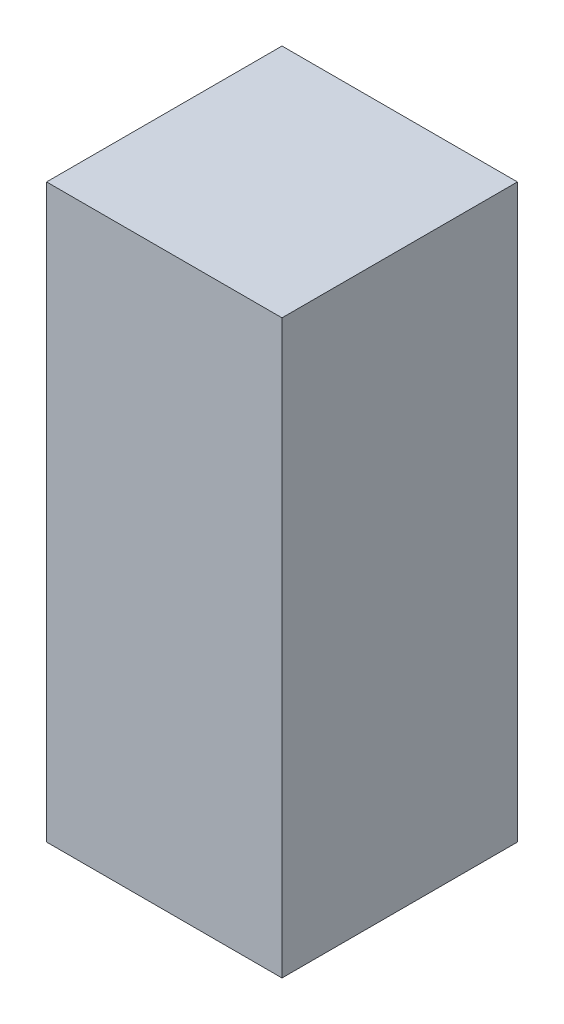
ISO-10303-21;
HEADER;
FILE_DESCRIPTION(('STEP AP214'),'2;1');
FILE_NAME('part.step','',(''),(''),'','','');
FILE_SCHEMA(('AUTOMOTIVE_DESIGN { 1 0 10303 214 1 1 1 1 }'));
ENDSEC;
DATA;
#1=APPLICATION_CONTEXT('core data for automotive mechanical design processes');
#2=APPLICATION_PROTOCOL_DEFINITION('international standard','automotive_design',2000,#1);
#3=PRODUCT_CONTEXT('',#1,'mechanical');
#4=PRODUCT('Part','Part','',(#3));
#5=PRODUCT_RELATED_PRODUCT_CATEGORY('part','',(#4));
#6=PRODUCT_DEFINITION_FORMATION('','',#4);
#7=PRODUCT_DEFINITION_CONTEXT('part definition',#1,'design');
#8=PRODUCT_DEFINITION('design','',#6,#7);
#9=PRODUCT_DEFINITION_SHAPE('','',#8);
#10=(LENGTH_UNIT() NAMED_UNIT(*) SI_UNIT(.MILLI.,.METRE.));
#11=(NAMED_UNIT(*) PLANE_ANGLE_UNIT() SI_UNIT($,.RADIAN.));
#12=(NAMED_UNIT(*) SI_UNIT($,.STERADIAN.) SOLID_ANGLE_UNIT());
#13=UNCERTAINTY_MEASURE_WITH_UNIT(LENGTH_MEASURE(1.E-05),#10,'distance_accuracy_value','');
#14=(GEOMETRIC_REPRESENTATION_CONTEXT(3) GLOBAL_UNCERTAINTY_ASSIGNED_CONTEXT((#13)) GLOBAL_UNIT_ASSIGNED_CONTEXT((#10,
#11,#12)) REPRESENTATION_CONTEXT('',''));
#15=CARTESIAN_POINT('',(0.,0.,0.));
#16=DIRECTION('',(0.,0.,1.));
#17=DIRECTION('',(1.,0.,0.));
#18=AXIS2_PLACEMENT_3D('',#15,#16,#17);
#19=CARTESIAN_POINT('',(3.5,8.5,3.5));
#20=DIRECTION('',(-1.,0.,0.));
#21=DIRECTION('',(0.,0.,1.));
#22=AXIS2_PLACEMENT_3D('',#19,#20,#21);
#23=PLANE('',#22);
#24=DIRECTION('',(0.,0.,-1.));
#25=VECTOR('',#24,1.);
#26=CARTESIAN_POINT('',(3.5,-8.5,3.5));
#27=LINE('',#26,#25);
#28=CARTESIAN_POINT('',(3.5,-8.5,3.5));
#29=VERTEX_POINT('',#28);
#30=CARTESIAN_POINT('',(3.5,-8.5,-3.5));
#31=VERTEX_POINT('',#30);
#32=EDGE_CURVE('E98',#29,#31,#27,.T.);
#33=ORIENTED_EDGE('',*,*,#32,.T.);
#34=DIRECTION('',(0.,-1.,0.));
#35=VECTOR('',#34,1.);
#36=CARTESIAN_POINT('',(3.5,8.5,-3.5));
#37=LINE('',#36,#35);
#38=CARTESIAN_POINT('',(3.5,8.5,-3.5));
#39=VERTEX_POINT('',#38);
#40=EDGE_CURVE('E11',#39,#31,#37,.T.);
#41=ORIENTED_EDGE('',*,*,#40,.F.);
#42=DIRECTION('',(0.,0.,-1.));
#43=VECTOR('',#42,1.);
#44=CARTESIAN_POINT('',(3.5,8.5,3.5));
#45=LINE('',#44,#43);
#46=CARTESIAN_POINT('',(3.5,8.5,3.5));
#47=VERTEX_POINT('',#46);
#48=EDGE_CURVE('E86',#47,#39,#45,.T.);
#49=ORIENTED_EDGE('',*,*,#48,.F.);
#50=DIRECTION('',(0.,-1.,0.));
#51=VECTOR('',#50,1.);
#52=CARTESIAN_POINT('',(3.5,8.5,3.5));
#53=LINE('',#52,#51);
#54=EDGE_CURVE('E94',#47,#29,#53,.T.);
#55=ORIENTED_EDGE('',*,*,#54,.T.);
#56=EDGE_LOOP('',(#33,#41,#49,#55));
#57=FACE_BOUND('',#56,.T.);
#58=ADVANCED_FACE('F35',(#57),#23,.F.);
#59=CARTESIAN_POINT('',(-3.5,8.5,-3.5));
#60=DIRECTION('',(0.,0.,1.));
#61=DIRECTION('',(1.,0.,0.));
#62=AXIS2_PLACEMENT_3D('',#59,#60,#61);
#63=PLANE('',#62);
#64=DIRECTION('',(-1.,0.,0.));
#65=VECTOR('',#64,1.);
#66=CARTESIAN_POINT('',(-3.5,-8.5,-3.5));
#67=LINE('',#66,#65);
#68=CARTESIAN_POINT('',(-3.5,-8.5,-3.5));
#69=VERTEX_POINT('',#68);
#70=EDGE_CURVE('E90',#31,#69,#67,.T.);
#71=ORIENTED_EDGE('',*,*,#70,.T.);
#72=DIRECTION('',(0.,-1.,0.));
#73=VECTOR('',#72,1.);
#74=CARTESIAN_POINT('',(-3.5,8.5,-3.5));
#75=LINE('',#74,#73);
#76=CARTESIAN_POINT('',(-3.5,8.5,-3.5));
#77=VERTEX_POINT('',#76);
#78=EDGE_CURVE('E43',#77,#69,#75,.T.);
#79=ORIENTED_EDGE('',*,*,#78,.F.);
#80=DIRECTION('',(-1.,0.,0.));
#81=VECTOR('',#80,1.);
#82=CARTESIAN_POINT('',(-3.5,8.5,-3.5));
#83=LINE('',#82,#81);
#84=EDGE_CURVE('E81',#39,#77,#83,.T.);
#85=ORIENTED_EDGE('',*,*,#84,.F.);
#86=ORIENTED_EDGE('',*,*,#40,.T.);
#87=EDGE_LOOP('',(#71,#79,#85,#86));
#88=FACE_BOUND('',#87,.T.);
#89=ADVANCED_FACE('F89',(#88),#63,.F.);
#90=CARTESIAN_POINT('',(-3.5,8.5,3.5));
#91=DIRECTION('',(1.,0.,0.));
#92=DIRECTION('',(0.,0.,-1.));
#93=AXIS2_PLACEMENT_3D('',#90,#91,#92);
#94=PLANE('',#93);
#95=DIRECTION('',(0.,0.,1.));
#96=VECTOR('',#95,1.);
#97=CARTESIAN_POINT('',(-3.5,-8.5,3.5));
#98=LINE('',#97,#96);
#99=CARTESIAN_POINT('',(-3.5,-8.5,3.5));
#100=VERTEX_POINT('',#99);
#101=EDGE_CURVE('E68',#69,#100,#98,.T.);
#102=ORIENTED_EDGE('',*,*,#101,.T.);
#103=DIRECTION('',(0.,-1.,0.));
#104=VECTOR('',#103,1.);
#105=CARTESIAN_POINT('',(-3.5,8.5,3.5));
#106=LINE('',#105,#104);
#107=CARTESIAN_POINT('',(-3.5,8.5,3.5));
#108=VERTEX_POINT('',#107);
#109=EDGE_CURVE('E91',#108,#100,#106,.T.);
#110=ORIENTED_EDGE('',*,*,#109,.F.);
#111=DIRECTION('',(0.,0.,1.));
#112=VECTOR('',#111,1.);
#113=CARTESIAN_POINT('',(-3.5,8.5,3.5));
#114=LINE('',#113,#112);
#115=EDGE_CURVE('E84',#77,#108,#114,.T.);
#116=ORIENTED_EDGE('',*,*,#115,.F.);
#117=ORIENTED_EDGE('',*,*,#78,.T.);
#118=EDGE_LOOP('',(#102,#110,#116,#117));
#119=FACE_BOUND('',#118,.T.);
#120=ADVANCED_FACE('F92',(#119),#94,.F.);
#121=CARTESIAN_POINT('',(-3.5,8.5,3.5));
#122=DIRECTION('',(0.,0.,-1.));
#123=DIRECTION('',(-1.,0.,0.));
#124=AXIS2_PLACEMENT_3D('',#121,#122,#123);
#125=PLANE('',#124);
#126=DIRECTION('',(1.,0.,0.));
#127=VECTOR('',#126,1.);
#128=CARTESIAN_POINT('',(-3.5,-8.5,3.5));
#129=LINE('',#128,#127);
#130=EDGE_CURVE('E74',#100,#29,#129,.T.);
#131=ORIENTED_EDGE('',*,*,#130,.T.);
#132=ORIENTED_EDGE('',*,*,#54,.F.);
#133=DIRECTION('',(1.,0.,0.));
#134=VECTOR('',#133,1.);
#135=CARTESIAN_POINT('',(-3.5,8.5,3.5));
#136=LINE('',#135,#134);
#137=EDGE_CURVE('E51',#108,#47,#136,.T.);
#138=ORIENTED_EDGE('',*,*,#137,.F.);
#139=ORIENTED_EDGE('',*,*,#109,.T.);
#140=EDGE_LOOP('',(#131,#132,#138,#139));
#141=FACE_BOUND('',#140,.T.);
#142=ADVANCED_FACE('F105',(#141),#125,.F.);
#143=CARTESIAN_POINT('',(0.,8.5,0.));
#144=DIRECTION('',(0.,-1.,0.));
#145=DIRECTION('',(0.,0.,-1.));
#146=AXIS2_PLACEMENT_3D('',#143,#144,#145);
#147=PLANE('',#146);
#148=ORIENTED_EDGE('',*,*,#48,.T.);
#149=ORIENTED_EDGE('',*,*,#84,.T.);
#150=ORIENTED_EDGE('',*,*,#115,.T.);
#151=ORIENTED_EDGE('',*,*,#137,.T.);
#152=EDGE_LOOP('',(#148,#149,#150,#151));
#153=FACE_BOUND('',#152,.T.);
#154=ADVANCED_FACE('F82',(#153),#147,.F.);
#155=CARTESIAN_POINT('',(0.,-8.5,0.));
#156=DIRECTION('',(0.,-1.,0.));
#157=DIRECTION('',(0.,0.,-1.));
#158=AXIS2_PLACEMENT_3D('',#155,#156,#157);
#159=PLANE('',#158);
#160=ORIENTED_EDGE('',*,*,#32,.F.);
#161=ORIENTED_EDGE('',*,*,#130,.F.);
#162=ORIENTED_EDGE('',*,*,#101,.F.);
#163=ORIENTED_EDGE('',*,*,#70,.F.);
#164=EDGE_LOOP('',(#160,#161,#162,#163));
#165=FACE_BOUND('',#164,.T.);
#166=ADVANCED_FACE('F108',(#165),#159,.T.);
#167=CLOSED_SHELL('',(#58,#89,#120,#142,#154,#166));
#168=MANIFOLD_SOLID_BREP('B2',#167);
#169=ADVANCED_BREP_SHAPE_REPRESENTATION('',(#18,#168),#14);
#170=SHAPE_DEFINITION_REPRESENTATION(#9,#169);
ENDSEC;
END-ISO-10303-21;
